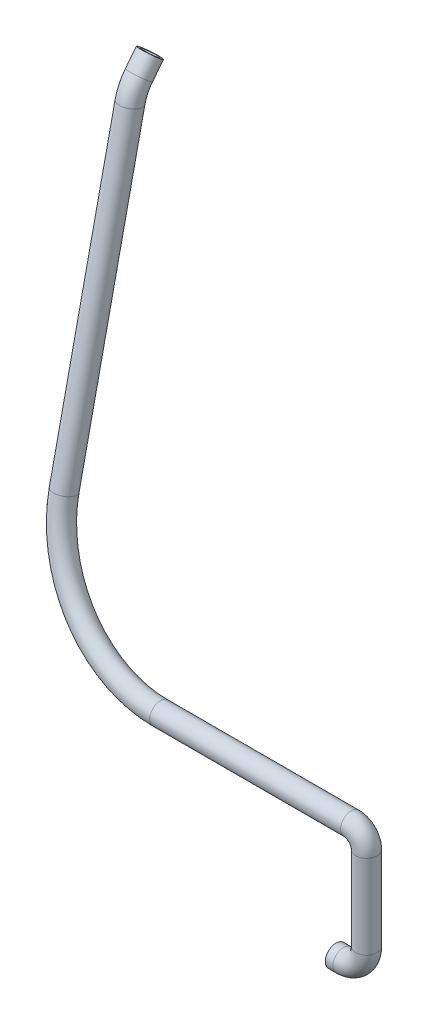
ISO-10303-21;
HEADER;
FILE_DESCRIPTION(('STEP AP214'),'2;1');
FILE_NAME('part.step','',(''),(''),'','','');
FILE_SCHEMA(('AUTOMOTIVE_DESIGN { 1 0 10303 214 1 1 1 1 }'));
ENDSEC;
DATA;
#1=APPLICATION_CONTEXT('core data for automotive mechanical design processes');
#2=APPLICATION_PROTOCOL_DEFINITION('international standard','automotive_design',2000,#1);
#3=PRODUCT_CONTEXT('',#1,'mechanical');
#4=PRODUCT('Part','Part','',(#3));
#5=PRODUCT_RELATED_PRODUCT_CATEGORY('part','',(#4));
#6=PRODUCT_DEFINITION_FORMATION('','',#4);
#7=PRODUCT_DEFINITION_CONTEXT('part definition',#1,'design');
#8=PRODUCT_DEFINITION('design','',#6,#7);
#9=PRODUCT_DEFINITION_SHAPE('','',#8);
#10=(LENGTH_UNIT() NAMED_UNIT(*) SI_UNIT(.MILLI.,.METRE.));
#11=(NAMED_UNIT(*) PLANE_ANGLE_UNIT() SI_UNIT($,.RADIAN.));
#12=(NAMED_UNIT(*) SI_UNIT($,.STERADIAN.) SOLID_ANGLE_UNIT());
#13=UNCERTAINTY_MEASURE_WITH_UNIT(LENGTH_MEASURE(1.E-05),#10,'distance_accuracy_value','');
#14=(GEOMETRIC_REPRESENTATION_CONTEXT(3) GLOBAL_UNCERTAINTY_ASSIGNED_CONTEXT((#13)) GLOBAL_UNIT_ASSIGNED_CONTEXT((#10,
#11,#12)) REPRESENTATION_CONTEXT('',''));
#15=CARTESIAN_POINT('',(0.,0.,0.));
#16=DIRECTION('',(0.,0.,1.));
#17=DIRECTION('',(1.,0.,0.));
#18=AXIS2_PLACEMENT_3D('',#15,#16,#17);
#19=CARTESIAN_POINT('',(0.,0.,0.));
#20=DIRECTION('',(-1.,0.,0.));
#21=DIRECTION('',(0.,0.212370986856464,-0.977189113704002));
#22=AXIS2_PLACEMENT_3D('',#19,#20,#21);
#23=PLANE('',#22);
#24=CARTESIAN_POINT('',(0.,0.,0.));
#25=DIRECTION('',(-1.,0.,0.));
#26=DIRECTION('',(0.,0.212370986856464,-0.977189113704002));
#27=AXIS2_PLACEMENT_3D('',#24,#25,#26);
#28=CIRCLE('',#27,5.);
#29=CARTESIAN_POINT('',(0.,1.06185493428232,-4.88594556852004));
#30=VERTEX_POINT('',#29);
#31=EDGE_CURVE('E303',#30,#30,#28,.T.);
#32=ORIENTED_EDGE('',*,*,#31,.F.);
#33=EDGE_LOOP('',(#32));
#34=FACE_BOUND('',#33,.T.);
#35=CARTESIAN_POINT('',(0.,0.,0.));
#36=DIRECTION('',(-1.,0.,0.));
#37=DIRECTION('',(0.,-1.,0.));
#38=AXIS2_PLACEMENT_3D('',#35,#36,#37);
#39=CIRCLE('',#38,7.);
#40=CARTESIAN_POINT('',(0.,-7.,0.));
#41=VERTEX_POINT('',#40);
#42=EDGE_CURVE('E62',#41,#41,#39,.T.);
#43=ORIENTED_EDGE('',*,*,#42,.T.);
#44=EDGE_LOOP('',(#43));
#45=FACE_BOUND('',#44,.T.);
#46=ADVANCED_FACE('F43',(#34,#45),#23,.T.);
#47=CARTESIAN_POINT('',(-195.,377.945936742269,-73.1820993920229));
#48=DIRECTION('',(0.,-0.782291449941888,0.622912584033922));
#49=DIRECTION('',(0.,-0.622912584033922,-0.782291449941888));
#50=AXIS2_PLACEMENT_3D('',#47,#48,#49);
#51=PLANE('',#50);
#52=CARTESIAN_POINT('',(-195.,377.945936742269,-73.1820993920229));
#53=DIRECTION('',(0.,-0.782291449941888,0.622912584033922));
#54=DIRECTION('',(0.,-0.622912584033922,-0.782291449941888));
#55=AXIS2_PLACEMENT_3D('',#52,#53,#54);
#56=CIRCLE('',#55,5.);
#57=CARTESIAN_POINT('',(-195.,374.831373822099,-77.0935566417323));
#58=VERTEX_POINT('',#57);
#59=EDGE_CURVE('E65',#58,#58,#56,.T.);
#60=ORIENTED_EDGE('',*,*,#59,.T.);
#61=EDGE_LOOP('',(#60));
#62=FACE_BOUND('',#61,.T.);
#63=CARTESIAN_POINT('',(-195.,377.945936742269,-73.1820993920229));
#64=DIRECTION('',(0.,-0.782291449941888,0.622912584033922));
#65=DIRECTION('',(0.,-0.622912584033922,-0.782291449941888));
#66=AXIS2_PLACEMENT_3D('',#63,#64,#65);
#67=CIRCLE('',#66,7.);
#68=CARTESIAN_POINT('',(-195.,373.585548654031,-78.6581395416161));
#69=VERTEX_POINT('',#68);
#70=EDGE_CURVE('E11',#69,#69,#67,.T.);
#71=ORIENTED_EDGE('',*,*,#70,.F.);
#72=EDGE_LOOP('',(#71));
#73=FACE_BOUND('',#72,.T.);
#74=ADVANCED_FACE('F153',(#62,#73),#51,.F.);
#75=CARTESIAN_POINT('',(0.,0.,0.));
#76=DIRECTION('',(1.,0.,0.));
#77=DIRECTION('',(0.,0.,-1.));
#78=AXIS2_PLACEMENT_3D('',#75,#76,#77);
#79=CYLINDRICAL_SURFACE('',#78,7.);
#80=CARTESIAN_POINT('',(4.99999999999998,0.,0.));
#81=DIRECTION('',(1.,0.,0.));
#82=DIRECTION('',(0.,0.,-1.));
#83=AXIS2_PLACEMENT_3D('',#80,#81,#82);
#84=CIRCLE('',#83,7.);
#85=CARTESIAN_POINT('',(4.99999999999998,-7.00000000000001,0.));
#86=VERTEX_POINT('',#85);
#87=EDGE_CURVE('E64',#86,#86,#84,.F.);
#88=ORIENTED_EDGE('',*,*,#87,.T.);
#89=EDGE_LOOP('',(#88));
#90=FACE_BOUND('',#89,.T.);
#91=ORIENTED_EDGE('',*,*,#42,.F.);
#92=EDGE_LOOP('',(#91));
#93=FACE_BOUND('',#92,.T.);
#94=ADVANCED_FACE('F156',(#90,#93),#79,.T.);
#95=CARTESIAN_POINT('',(5.,15.,0.));
#96=DIRECTION('',(0.,0.,1.));
#97=DIRECTION('',(1.,0.,0.));
#98=AXIS2_PLACEMENT_3D('',#95,#96,#97);
#99=TOROIDAL_SURFACE('',#98,15.,7.);
#100=CARTESIAN_POINT('',(20.,15.0000000000001,0.));
#101=DIRECTION('',(0.,-1.,0.));
#102=DIRECTION('',(1.,0.,0.));
#103=AXIS2_PLACEMENT_3D('',#100,#101,#102);
#104=CIRCLE('',#103,7.);
#105=CARTESIAN_POINT('',(27.,15.0000000000001,0.));
#106=VERTEX_POINT('',#105);
#107=EDGE_CURVE('E69',#106,#106,#104,.T.);
#108=CARTESIAN_POINT('',(5.,15.,0.));
#109=DIRECTION('',(0.,0.,1.));
#110=DIRECTION('',(1.,0.,0.));
#111=AXIS2_PLACEMENT_3D('',#108,#109,#110);
#112=CIRCLE('',#111,22.);
#113=EDGE_CURVE('',#86,#106,#112,.T.);
#114=ORIENTED_EDGE('',*,*,#87,.F.);
#115=ORIENTED_EDGE('',*,*,#107,.T.);
#116=ORIENTED_EDGE('',*,*,#113,.T.);
#117=ORIENTED_EDGE('',*,*,#113,.F.);
#118=EDGE_LOOP('',(#114,#116,#115,#117));
#119=FACE_BOUND('',#118,.T.);
#120=ADVANCED_FACE('F162',(#119),#99,.T.);
#121=CARTESIAN_POINT('',(20.,15.0000000000001,0.));
#122=DIRECTION('',(0.,1.,0.));
#123=DIRECTION('',(-1.,0.,0.));
#124=AXIS2_PLACEMENT_3D('',#121,#122,#123);
#125=CYLINDRICAL_SURFACE('',#124,7.);
#126=CARTESIAN_POINT('',(20.,70.,0.));
#127=DIRECTION('',(0.,1.,0.));
#128=DIRECTION('',(-1.,0.,0.));
#129=AXIS2_PLACEMENT_3D('',#126,#127,#128);
#130=CIRCLE('',#129,7.);
#131=CARTESIAN_POINT('',(27.,70.0000000000001,0.));
#132=VERTEX_POINT('',#131);
#133=EDGE_CURVE('E83',#132,#132,#130,.F.);
#134=ORIENTED_EDGE('',*,*,#133,.T.);
#135=EDGE_LOOP('',(#134));
#136=FACE_BOUND('',#135,.T.);
#137=ORIENTED_EDGE('',*,*,#107,.F.);
#138=EDGE_LOOP('',(#137));
#139=FACE_BOUND('',#138,.T.);
#140=ADVANCED_FACE('F166',(#136,#139),#125,.T.);
#141=CARTESIAN_POINT('',(10.,70.,0.));
#142=DIRECTION('',(0.,0.,1.));
#143=DIRECTION('',(1.,0.,0.));
#144=AXIS2_PLACEMENT_3D('',#141,#142,#143);
#145=TOROIDAL_SURFACE('',#144,9.99999999999999,7.);
#146=CARTESIAN_POINT('',(9.99999999999999,80.,0.));
#147=DIRECTION('',(1.,0.,0.));
#148=DIRECTION('',(0.,1.,0.));
#149=AXIS2_PLACEMENT_3D('',#146,#147,#148);
#150=CIRCLE('',#149,7.);
#151=CARTESIAN_POINT('',(9.99999999999998,87.,0.));
#152=VERTEX_POINT('',#151);
#153=EDGE_CURVE('E86',#152,#152,#150,.T.);
#154=CARTESIAN_POINT('',(10.,70.,0.));
#155=DIRECTION('',(0.,0.,1.));
#156=DIRECTION('',(1.,0.,0.));
#157=AXIS2_PLACEMENT_3D('',#154,#155,#156);
#158=CIRCLE('',#157,17.);
#159=EDGE_CURVE('',#132,#152,#158,.T.);
#160=ORIENTED_EDGE('',*,*,#133,.F.);
#161=ORIENTED_EDGE('',*,*,#153,.T.);
#162=ORIENTED_EDGE('',*,*,#159,.T.);
#163=ORIENTED_EDGE('',*,*,#159,.F.);
#164=EDGE_LOOP('',(#160,#162,#161,#163));
#165=FACE_BOUND('',#164,.T.);
#166=ADVANCED_FACE('F170',(#165),#145,.T.);
#167=CARTESIAN_POINT('',(10.,80.,0.));
#168=DIRECTION('',(-1.,0.,0.));
#169=DIRECTION('',(0.,0.,1.));
#170=AXIS2_PLACEMENT_3D('',#167,#168,#169);
#171=CYLINDRICAL_SURFACE('',#170,7.);
#172=CARTESIAN_POINT('',(-115.,80.,0.));
#173=DIRECTION('',(-1.,0.,0.));
#174=DIRECTION('',(0.,0.,1.));
#175=AXIS2_PLACEMENT_3D('',#172,#173,#174);
#176=CIRCLE('',#175,7.);
#177=CARTESIAN_POINT('',(-115.,73.159676204072,1.48659690799523));
#178=VERTEX_POINT('',#177);
#179=EDGE_CURVE('E89',#178,#178,#176,.F.);
#180=ORIENTED_EDGE('',*,*,#179,.T.);
#181=EDGE_LOOP('',(#180));
#182=FACE_BOUND('',#181,.T.);
#183=ORIENTED_EDGE('',*,*,#153,.F.);
#184=EDGE_LOOP('',(#183));
#185=FACE_BOUND('',#184,.T.);
#186=ADVANCED_FACE('F106',(#182,#185),#171,.T.);
#187=CARTESIAN_POINT('',(-115.,158.17512909632,-16.9896789485171));
#188=DIRECTION('',(0.,-0.212370986856464,-0.977189113704001));
#189=DIRECTION('',(0.,0.977189113704002,-0.212370986856464));
#190=AXIS2_PLACEMENT_3D('',#187,#188,#189);
#191=TOROIDAL_SURFACE('',#190,80.,7.);
#192=CARTESIAN_POINT('',(-195.,158.17512909632,-16.9896789485171));
#193=DIRECTION('',(0.,-0.977189113704002,0.212370986856464));
#194=DIRECTION('',(0.,-0.212370986856464,-0.977189113704001));
#195=AXIS2_PLACEMENT_3D('',#192,#193,#194);
#196=CIRCLE('',#195,7.);
#197=CARTESIAN_POINT('',(-202.,158.17512909632,-16.9896789485171));
#198=VERTEX_POINT('',#197);
#199=EDGE_CURVE('E59',#198,#198,#196,.T.);
#200=CARTESIAN_POINT('',(-115.,158.17512909632,-16.9896789485171));
#201=DIRECTION('',(0.,-0.212370986856464,-0.977189113704001));
#202=DIRECTION('',(0.,0.977189113704002,-0.212370986856464));
#203=AXIS2_PLACEMENT_3D('',#200,#201,#202);
#204=CIRCLE('',#203,87.);
#205=EDGE_CURVE('',#178,#198,#204,.T.);
#206=ORIENTED_EDGE('',*,*,#179,.F.);
#207=ORIENTED_EDGE('',*,*,#199,.T.);
#208=ORIENTED_EDGE('',*,*,#205,.T.);
#209=ORIENTED_EDGE('',*,*,#205,.F.);
#210=EDGE_LOOP('',(#206,#208,#207,#209));
#211=FACE_BOUND('',#210,.T.);
#212=ADVANCED_FACE('F94',(#211),#191,.T.);
#213=CARTESIAN_POINT('',(-195.,158.17512909632,-16.9896789485171));
#214=DIRECTION('',(0.,0.977189113704001,-0.212370986856464));
#215=DIRECTION('',(0.,0.212370986856464,0.977189113704001));
#216=AXIS2_PLACEMENT_3D('',#213,#214,#215);
#217=CYLINDRICAL_SURFACE('',#216,7.);
#218=CARTESIAN_POINT('',(-195.,356.544583619664,-60.1010032853351));
#219=DIRECTION('',(0.,0.977189113704001,-0.212370986856464));
#220=DIRECTION('',(0.,0.212370986856464,0.977189113704001));
#221=AXIS2_PLACEMENT_3D('',#218,#219,#220);
#222=CIRCLE('',#221,7.);
#223=CARTESIAN_POINT('',(-195.,358.031180527659,-53.2606794894071));
#224=VERTEX_POINT('',#223);
#225=EDGE_CURVE('E54',#224,#224,#222,.F.);
#226=ORIENTED_EDGE('',*,*,#225,.T.);
#227=EDGE_LOOP('',(#226));
#228=FACE_BOUND('',#227,.T.);
#229=ORIENTED_EDGE('',*,*,#199,.F.);
#230=EDGE_LOOP('',(#229));
#231=FACE_BOUND('',#230,.T.);
#232=ADVANCED_FACE('F97',(#228,#231),#217,.T.);
#233=CARTESIAN_POINT('',(-195.,350.17345401397,-89.4166766964551));
#234=DIRECTION('',(-1.,0.,0.));
#235=DIRECTION('',(0.,0.,1.));
#236=AXIS2_PLACEMENT_3D('',#233,#234,#235);
#237=TOROIDAL_SURFACE('',#236,30.,7.);
#238=CARTESIAN_POINT('',(-195.,368.860831534987,-65.9479331981982));
#239=DIRECTION('',(0.,-0.782291449941898,0.62291258403391));
#240=DIRECTION('',(0.,-0.62291258403391,-0.782291449941898));
#241=AXIS2_PLACEMENT_3D('',#238,#239,#240);
#242=CIRCLE('',#241,7.);
#243=CARTESIAN_POINT('',(-195.,373.221219623224,-60.4718930486049));
#244=VERTEX_POINT('',#243);
#245=EDGE_CURVE('E50',#244,#244,#242,.T.);
#246=CARTESIAN_POINT('',(-195.,350.17345401397,-89.4166766964551));
#247=DIRECTION('',(-1.,0.,0.));
#248=DIRECTION('',(0.,0.,1.));
#249=AXIS2_PLACEMENT_3D('',#246,#247,#248);
#250=CIRCLE('',#249,37.);
#251=EDGE_CURVE('',#224,#244,#250,.T.);
#252=ORIENTED_EDGE('',*,*,#225,.F.);
#253=ORIENTED_EDGE('',*,*,#245,.T.);
#254=ORIENTED_EDGE('',*,*,#251,.T.);
#255=ORIENTED_EDGE('',*,*,#251,.F.);
#256=EDGE_LOOP('',(#252,#254,#253,#255));
#257=FACE_BOUND('',#256,.T.);
#258=ADVANCED_FACE('F99',(#257),#237,.T.);
#259=CARTESIAN_POINT('',(-195.,368.860831534987,-65.9479331981985));
#260=DIRECTION('',(0.,0.78229144994189,-0.622912584033919));
#261=DIRECTION('',(0.,0.622912584033919,0.782291449941891));
#262=AXIS2_PLACEMENT_3D('',#259,#260,#261);
#263=CYLINDRICAL_SURFACE('',#262,7.);
#264=ORIENTED_EDGE('',*,*,#70,.T.);
#265=EDGE_LOOP('',(#264));
#266=FACE_BOUND('',#265,.T.);
#267=ORIENTED_EDGE('',*,*,#245,.F.);
#268=EDGE_LOOP('',(#267));
#269=FACE_BOUND('',#268,.T.);
#270=ADVANCED_FACE('F45',(#266,#269),#263,.T.);
#271=CARTESIAN_POINT('',(0.,0.,0.));
#272=DIRECTION('',(1.,0.,0.));
#273=DIRECTION('',(0.,0.,-1.));
#274=AXIS2_PLACEMENT_3D('',#271,#272,#273);
#275=CYLINDRICAL_SURFACE('',#274,5.);
#276=CARTESIAN_POINT('',(5.,0.,0.));
#277=DIRECTION('',(-1.,0.,0.));
#278=DIRECTION('',(0.,0.212370986856464,-0.977189113704002));
#279=AXIS2_PLACEMENT_3D('',#276,#277,#278);
#280=CIRCLE('',#279,5.);
#281=CARTESIAN_POINT('',(5.00000000000001,-5.,0.));
#282=VERTEX_POINT('',#281);
#283=EDGE_CURVE('E304',#282,#282,#280,.T.);
#284=ORIENTED_EDGE('',*,*,#283,.F.);
#285=EDGE_LOOP('',(#284));
#286=FACE_BOUND('',#285,.T.);
#287=ORIENTED_EDGE('',*,*,#31,.T.);
#288=EDGE_LOOP('',(#287));
#289=FACE_BOUND('',#288,.T.);
#290=ADVANCED_FACE('F109',(#286,#289),#275,.F.);
#291=CARTESIAN_POINT('',(5.,15.,0.));
#292=DIRECTION('',(0.,0.,1.));
#293=DIRECTION('',(1.,0.,0.));
#294=AXIS2_PLACEMENT_3D('',#291,#292,#293);
#295=TOROIDAL_SURFACE('',#294,15.,5.);
#296=CARTESIAN_POINT('',(20.,15.0000000000001,0.));
#297=DIRECTION('',(0.,-1.,0.));
#298=DIRECTION('',(-0.212370986856464,0.,-0.977189113704002));
#299=AXIS2_PLACEMENT_3D('',#296,#297,#298);
#300=CIRCLE('',#299,5.);
#301=CARTESIAN_POINT('',(25.,15.0000000000001,0.));
#302=VERTEX_POINT('',#301);
#303=EDGE_CURVE('E307',#302,#302,#300,.T.);
#304=CARTESIAN_POINT('',(5.,15.,0.));
#305=DIRECTION('',(0.,0.,1.));
#306=DIRECTION('',(1.,0.,0.));
#307=AXIS2_PLACEMENT_3D('',#304,#305,#306);
#308=CIRCLE('',#307,20.);
#309=EDGE_CURVE('',#282,#302,#308,.T.);
#310=ORIENTED_EDGE('',*,*,#283,.T.);
#311=ORIENTED_EDGE('',*,*,#303,.F.);
#312=ORIENTED_EDGE('',*,*,#309,.T.);
#313=ORIENTED_EDGE('',*,*,#309,.F.);
#314=EDGE_LOOP('',(#310,#312,#311,#313));
#315=FACE_BOUND('',#314,.T.);
#316=ADVANCED_FACE('F113',(#315),#295,.F.);
#317=CARTESIAN_POINT('',(20.,15.0000000000001,0.));
#318=DIRECTION('',(0.,1.,0.));
#319=DIRECTION('',(-1.,0.,0.));
#320=AXIS2_PLACEMENT_3D('',#317,#318,#319);
#321=CYLINDRICAL_SURFACE('',#320,5.);
#322=CARTESIAN_POINT('',(20.,70.0000000000001,0.));
#323=DIRECTION('',(0.,-1.,0.));
#324=DIRECTION('',(-0.212370986856464,0.,-0.977189113704002));
#325=AXIS2_PLACEMENT_3D('',#322,#323,#324);
#326=CIRCLE('',#325,5.);
#327=CARTESIAN_POINT('',(25.,70.0000000000001,0.));
#328=VERTEX_POINT('',#327);
#329=EDGE_CURVE('E312',#328,#328,#326,.T.);
#330=ORIENTED_EDGE('',*,*,#329,.F.);
#331=EDGE_LOOP('',(#330));
#332=FACE_BOUND('',#331,.T.);
#333=ORIENTED_EDGE('',*,*,#303,.T.);
#334=EDGE_LOOP('',(#333));
#335=FACE_BOUND('',#334,.T.);
#336=ADVANCED_FACE('F120',(#332,#335),#321,.F.);
#337=CARTESIAN_POINT('',(10.,70.,0.));
#338=DIRECTION('',(0.,0.,1.));
#339=DIRECTION('',(1.,0.,0.));
#340=AXIS2_PLACEMENT_3D('',#337,#338,#339);
#341=TOROIDAL_SURFACE('',#340,9.99999999999999,5.);
#342=CARTESIAN_POINT('',(10.,80.,0.));
#343=DIRECTION('',(1.,0.,0.));
#344=DIRECTION('',(0.,-0.212370986856464,-0.977189113704002));
#345=AXIS2_PLACEMENT_3D('',#342,#343,#344);
#346=CIRCLE('',#345,5.);
#347=CARTESIAN_POINT('',(10.,85.,0.));
#348=VERTEX_POINT('',#347);
#349=EDGE_CURVE('E315',#348,#348,#346,.T.);
#350=CARTESIAN_POINT('',(10.,70.,0.));
#351=DIRECTION('',(0.,0.,1.));
#352=DIRECTION('',(1.,0.,0.));
#353=AXIS2_PLACEMENT_3D('',#350,#351,#352);
#354=CIRCLE('',#353,15.);
#355=EDGE_CURVE('',#328,#348,#354,.T.);
#356=ORIENTED_EDGE('',*,*,#329,.T.);
#357=ORIENTED_EDGE('',*,*,#349,.F.);
#358=ORIENTED_EDGE('',*,*,#355,.T.);
#359=ORIENTED_EDGE('',*,*,#355,.F.);
#360=EDGE_LOOP('',(#356,#358,#357,#359));
#361=FACE_BOUND('',#360,.T.);
#362=ADVANCED_FACE('F128',(#361),#341,.F.);
#363=CARTESIAN_POINT('',(10.,80.,0.));
#364=DIRECTION('',(-1.,0.,0.));
#365=DIRECTION('',(0.,0.,1.));
#366=AXIS2_PLACEMENT_3D('',#363,#364,#365);
#367=CYLINDRICAL_SURFACE('',#366,5.);
#368=CARTESIAN_POINT('',(-115.,80.,0.));
#369=DIRECTION('',(1.,0.,0.));
#370=DIRECTION('',(0.,-0.212370986856464,-0.977189113704002));
#371=AXIS2_PLACEMENT_3D('',#368,#369,#370);
#372=CIRCLE('',#371,5.);
#373=CARTESIAN_POINT('',(-115.,75.11405443148,1.0618549342823));
#374=VERTEX_POINT('',#373);
#375=EDGE_CURVE('E318',#374,#374,#372,.T.);
#376=ORIENTED_EDGE('',*,*,#375,.F.);
#377=EDGE_LOOP('',(#376));
#378=FACE_BOUND('',#377,.T.);
#379=ORIENTED_EDGE('',*,*,#349,.T.);
#380=EDGE_LOOP('',(#379));
#381=FACE_BOUND('',#380,.T.);
#382=ADVANCED_FACE('F132',(#378,#381),#367,.F.);
#383=CARTESIAN_POINT('',(-115.,158.17512909632,-16.9896789485171));
#384=DIRECTION('',(0.,-0.212370986856464,-0.977189113704001));
#385=DIRECTION('',(0.,0.977189113704002,-0.212370986856464));
#386=AXIS2_PLACEMENT_3D('',#383,#384,#385);
#387=TOROIDAL_SURFACE('',#386,80.,5.);
#388=CARTESIAN_POINT('',(-195.,158.17512909632,-16.9896789485171));
#389=DIRECTION('',(0.,-0.977189113704001,0.212370986856468));
#390=DIRECTION('',(0.,-0.212370986856468,-0.977189113704001));
#391=AXIS2_PLACEMENT_3D('',#388,#389,#390);
#392=CIRCLE('',#391,5.);
#393=CARTESIAN_POINT('',(-200.,158.17512909632,-16.9896789485171));
#394=VERTEX_POINT('',#393);
#395=EDGE_CURVE('E321',#394,#394,#392,.T.);
#396=CARTESIAN_POINT('',(-115.,158.17512909632,-16.9896789485171));
#397=DIRECTION('',(0.,-0.212370986856464,-0.977189113704001));
#398=DIRECTION('',(0.,0.977189113704002,-0.212370986856464));
#399=AXIS2_PLACEMENT_3D('',#396,#397,#398);
#400=CIRCLE('',#399,85.);
#401=EDGE_CURVE('',#374,#394,#400,.T.);
#402=ORIENTED_EDGE('',*,*,#375,.T.);
#403=ORIENTED_EDGE('',*,*,#395,.F.);
#404=ORIENTED_EDGE('',*,*,#401,.T.);
#405=ORIENTED_EDGE('',*,*,#401,.F.);
#406=EDGE_LOOP('',(#402,#404,#403,#405));
#407=FACE_BOUND('',#406,.T.);
#408=ADVANCED_FACE('F136',(#407),#387,.F.);
#409=CARTESIAN_POINT('',(-195.,158.17512909632,-16.9896789485171));
#410=DIRECTION('',(0.,0.977189113704001,-0.212370986856464));
#411=DIRECTION('',(0.,0.212370986856464,0.977189113704001));
#412=AXIS2_PLACEMENT_3D('',#409,#410,#411);
#413=CYLINDRICAL_SURFACE('',#412,5.);
#414=CARTESIAN_POINT('',(-195.,356.544583619664,-60.1010032853351));
#415=DIRECTION('',(0.,-0.977189113704001,0.212370986856468));
#416=DIRECTION('',(0.,-0.212370986856468,-0.977189113704001));
#417=AXIS2_PLACEMENT_3D('',#414,#415,#416);
#418=CIRCLE('',#417,5.);
#419=CARTESIAN_POINT('',(-195.,357.606438553946,-55.2150577168151));
#420=VERTEX_POINT('',#419);
#421=EDGE_CURVE('E77',#420,#420,#418,.T.);
#422=ORIENTED_EDGE('',*,*,#421,.F.);
#423=EDGE_LOOP('',(#422));
#424=FACE_BOUND('',#423,.T.);
#425=ORIENTED_EDGE('',*,*,#395,.T.);
#426=EDGE_LOOP('',(#425));
#427=FACE_BOUND('',#426,.T.);
#428=ADVANCED_FACE('F140',(#424,#427),#413,.F.);
#429=CARTESIAN_POINT('',(-195.,350.17345401397,-89.4166766964551));
#430=DIRECTION('',(-1.,0.,0.));
#431=DIRECTION('',(0.,0.,1.));
#432=AXIS2_PLACEMENT_3D('',#429,#430,#431);
#433=TOROIDAL_SURFACE('',#432,30.,5.);
#434=CARTESIAN_POINT('',(-195.000000000001,368.860831534987,-65.9479331981982));
#435=DIRECTION('',(0.,-0.782291449941888,0.622912584033922));
#436=DIRECTION('',(0.,-0.622912584033922,-0.782291449941888));
#437=AXIS2_PLACEMENT_3D('',#434,#435,#436);
#438=CIRCLE('',#437,5.);
#439=CARTESIAN_POINT('',(-195.000000000001,371.975394455157,-62.0364759484887));
#440=VERTEX_POINT('',#439);
#441=EDGE_CURVE('E72',#440,#440,#438,.T.);
#442=CARTESIAN_POINT('',(-195.,350.17345401397,-89.4166766964551));
#443=DIRECTION('',(-1.,0.,0.));
#444=DIRECTION('',(0.,0.,1.));
#445=AXIS2_PLACEMENT_3D('',#442,#443,#444);
#446=CIRCLE('',#445,35.);
#447=EDGE_CURVE('',#420,#440,#446,.T.);
#448=ORIENTED_EDGE('',*,*,#421,.T.);
#449=ORIENTED_EDGE('',*,*,#441,.F.);
#450=ORIENTED_EDGE('',*,*,#447,.T.);
#451=ORIENTED_EDGE('',*,*,#447,.F.);
#452=EDGE_LOOP('',(#448,#450,#449,#451));
#453=FACE_BOUND('',#452,.T.);
#454=ADVANCED_FACE('F144',(#453),#433,.F.);
#455=CARTESIAN_POINT('',(-195.,368.860831534987,-65.9479331981985));
#456=DIRECTION('',(0.,0.78229144994189,-0.622912584033919));
#457=DIRECTION('',(0.,0.622912584033919,0.782291449941891));
#458=AXIS2_PLACEMENT_3D('',#455,#456,#457);
#459=CYLINDRICAL_SURFACE('',#458,5.);
#460=ORIENTED_EDGE('',*,*,#59,.F.);
#461=EDGE_LOOP('',(#460));
#462=FACE_BOUND('',#461,.T.);
#463=ORIENTED_EDGE('',*,*,#441,.T.);
#464=EDGE_LOOP('',(#463));
#465=FACE_BOUND('',#464,.T.);
#466=ADVANCED_FACE('F148',(#462,#465),#459,.F.);
#467=CLOSED_SHELL('',(#46,#74,#94,#120,#140,#166,#186,#212,#232,#258,#270,#290,#316,#336,#362,
#382,#408,#428,#454,#466));
#468=MANIFOLD_SOLID_BREP('B2',#467);
#469=ADVANCED_BREP_SHAPE_REPRESENTATION('',(#18,#468),#14);
#470=SHAPE_DEFINITION_REPRESENTATION(#9,#469);
ENDSEC;
END-ISO-10303-21;
